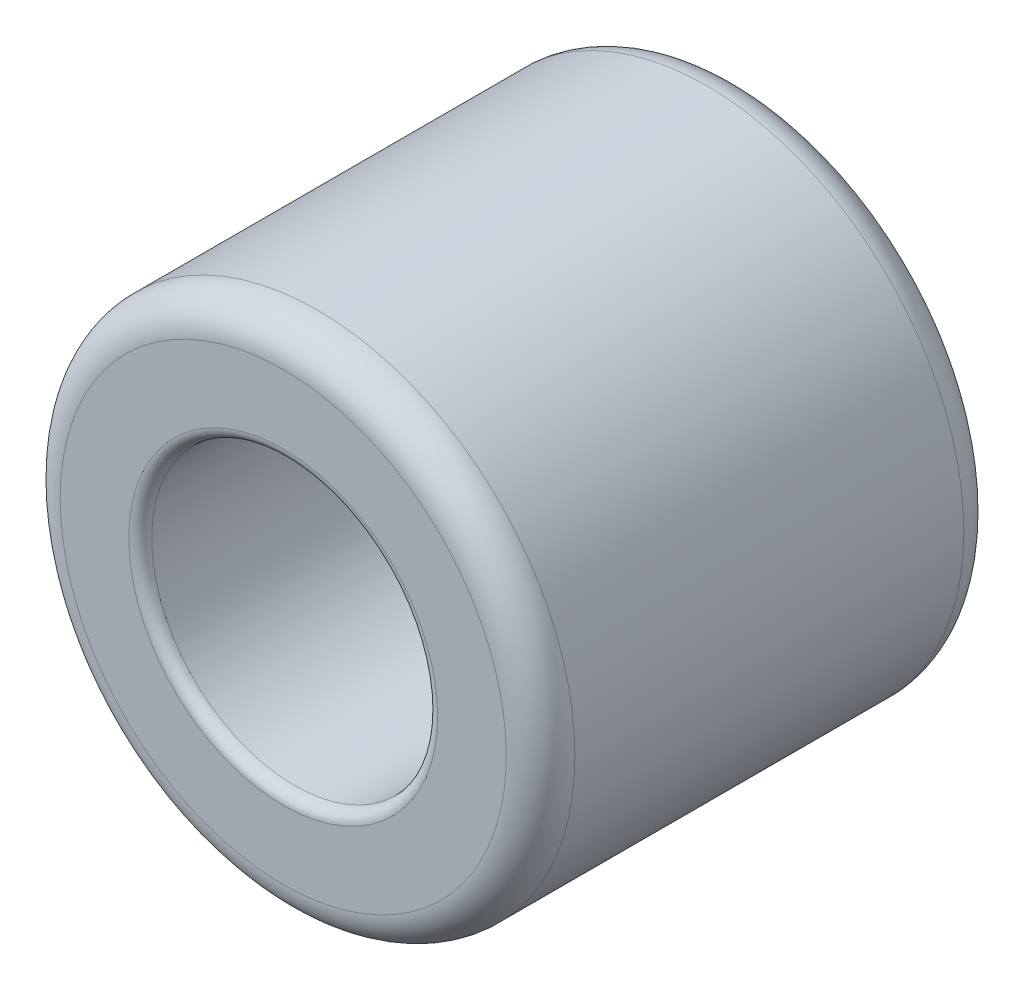
ISO-10303-21;
HEADER;
FILE_DESCRIPTION(('STEP AP214'),'2;1');
FILE_NAME('part.step','',(''),(''),'','','');
FILE_SCHEMA(('AUTOMOTIVE_DESIGN { 1 0 10303 214 1 1 1 1 }'));
ENDSEC;
DATA;
#1=APPLICATION_CONTEXT('core data for automotive mechanical design processes');
#2=APPLICATION_PROTOCOL_DEFINITION('international standard','automotive_design',2000,#1);
#3=PRODUCT_CONTEXT('',#1,'mechanical');
#4=PRODUCT('Part','Part','',(#3));
#5=PRODUCT_RELATED_PRODUCT_CATEGORY('part','',(#4));
#6=PRODUCT_DEFINITION_FORMATION('','',#4);
#7=PRODUCT_DEFINITION_CONTEXT('part definition',#1,'design');
#8=PRODUCT_DEFINITION('design','',#6,#7);
#9=PRODUCT_DEFINITION_SHAPE('','',#8);
#10=(LENGTH_UNIT() NAMED_UNIT(*) SI_UNIT(.MILLI.,.METRE.));
#11=(NAMED_UNIT(*) PLANE_ANGLE_UNIT() SI_UNIT($,.RADIAN.));
#12=(NAMED_UNIT(*) SI_UNIT($,.STERADIAN.) SOLID_ANGLE_UNIT());
#13=UNCERTAINTY_MEASURE_WITH_UNIT(LENGTH_MEASURE(1.E-05),#10,'distance_accuracy_value','');
#14=(GEOMETRIC_REPRESENTATION_CONTEXT(3) GLOBAL_UNCERTAINTY_ASSIGNED_CONTEXT((#13)) GLOBAL_UNIT_ASSIGNED_CONTEXT((#10,
#11,#12)) REPRESENTATION_CONTEXT('',''));
#15=CARTESIAN_POINT('',(0.,0.,0.));
#16=DIRECTION('',(0.,0.,1.));
#17=DIRECTION('',(1.,0.,0.));
#18=AXIS2_PLACEMENT_3D('',#15,#16,#17);
#19=CARTESIAN_POINT('',(0.,0.,20.));
#20=DIRECTION('',(0.,0.,-1.));
#21=DIRECTION('',(-1.,0.,0.));
#22=AXIS2_PLACEMENT_3D('',#19,#20,#21);
#23=CYLINDRICAL_SURFACE('',#22,12.5);
#24=CARTESIAN_POINT('',(0.,0.,-19.));
#25=DIRECTION('',(0.,0.,1.));
#26=DIRECTION('',(1.,0.,0.));
#27=AXIS2_PLACEMENT_3D('',#24,#25,#26);
#28=CIRCLE('',#27,12.5);
#29=CARTESIAN_POINT('',(12.5,0.,-19.));
#30=VERTEX_POINT('',#29);
#31=EDGE_CURVE('E46',#30,#30,#28,.F.);
#32=ORIENTED_EDGE('',*,*,#31,.T.);
#33=EDGE_LOOP('',(#32));
#34=FACE_BOUND('',#33,.T.);
#35=CARTESIAN_POINT('',(0.,0.,19.));
#36=DIRECTION('',(0.,0.,1.));
#37=DIRECTION('',(1.,0.,0.));
#38=AXIS2_PLACEMENT_3D('',#35,#36,#37);
#39=CIRCLE('',#38,12.5);
#40=CARTESIAN_POINT('',(12.5,0.,19.));
#41=VERTEX_POINT('',#40);
#42=EDGE_CURVE('E49',#41,#41,#39,.T.);
#43=ORIENTED_EDGE('',*,*,#42,.T.);
#44=EDGE_LOOP('',(#43));
#45=FACE_BOUND('',#44,.T.);
#46=ADVANCED_FACE('F39',(#34,#45),#23,.F.);
#47=CARTESIAN_POINT('',(0.,0.,20.));
#48=DIRECTION('',(0.,0.,-1.));
#49=DIRECTION('',(-1.,0.,0.));
#50=AXIS2_PLACEMENT_3D('',#47,#48,#49);
#51=CYLINDRICAL_SURFACE('',#50,22.5);
#52=CARTESIAN_POINT('',(0.,0.,-17.));
#53=DIRECTION('',(0.,0.,1.));
#54=DIRECTION('',(1.,0.,0.));
#55=AXIS2_PLACEMENT_3D('',#52,#53,#54);
#56=CIRCLE('',#55,22.5);
#57=CARTESIAN_POINT('',(22.5,0.,-17.));
#58=VERTEX_POINT('',#57);
#59=EDGE_CURVE('E61',#58,#58,#56,.T.);
#60=ORIENTED_EDGE('',*,*,#59,.T.);
#61=EDGE_LOOP('',(#60));
#62=FACE_BOUND('',#61,.T.);
#63=CARTESIAN_POINT('',(0.,0.,17.));
#64=DIRECTION('',(0.,0.,1.));
#65=DIRECTION('',(1.,0.,0.));
#66=AXIS2_PLACEMENT_3D('',#63,#64,#65);
#67=CIRCLE('',#66,22.5);
#68=CARTESIAN_POINT('',(22.5,0.,17.));
#69=VERTEX_POINT('',#68);
#70=EDGE_CURVE('E70',#69,#69,#67,.F.);
#71=ORIENTED_EDGE('',*,*,#70,.T.);
#72=EDGE_LOOP('',(#71));
#73=FACE_BOUND('',#72,.T.);
#74=ADVANCED_FACE('F75',(#62,#73),#51,.T.);
#75=CARTESIAN_POINT('',(0.,0.,20.));
#76=DIRECTION('',(0.,0.,1.));
#77=DIRECTION('',(1.,0.,0.));
#78=AXIS2_PLACEMENT_3D('',#75,#76,#77);
#79=PLANE('',#78);
#80=CARTESIAN_POINT('',(0.,0.,20.));
#81=DIRECTION('',(0.,0.,1.));
#82=DIRECTION('',(1.,0.,0.));
#83=AXIS2_PLACEMENT_3D('',#80,#81,#82);
#84=CIRCLE('',#83,13.5);
#85=CARTESIAN_POINT('',(13.5,0.,20.));
#86=VERTEX_POINT('',#85);
#87=EDGE_CURVE('E10',#86,#86,#84,.F.);
#88=ORIENTED_EDGE('',*,*,#87,.T.);
#89=EDGE_LOOP('',(#88));
#90=FACE_BOUND('',#89,.T.);
#91=CARTESIAN_POINT('',(0.,0.,20.));
#92=DIRECTION('',(0.,0.,1.));
#93=DIRECTION('',(1.,0.,0.));
#94=AXIS2_PLACEMENT_3D('',#91,#92,#93);
#95=CIRCLE('',#94,19.5);
#96=CARTESIAN_POINT('',(19.5,0.,20.));
#97=VERTEX_POINT('',#96);
#98=EDGE_CURVE('E56',#97,#97,#95,.T.);
#99=ORIENTED_EDGE('',*,*,#98,.T.);
#100=EDGE_LOOP('',(#99));
#101=FACE_BOUND('',#100,.T.);
#102=ADVANCED_FACE('F85',(#90,#101),#79,.T.);
#103=CARTESIAN_POINT('',(0.,0.,-20.));
#104=DIRECTION('',(0.,0.,1.));
#105=DIRECTION('',(1.,0.,0.));
#106=AXIS2_PLACEMENT_3D('',#103,#104,#105);
#107=PLANE('',#106);
#108=CARTESIAN_POINT('',(0.,0.,-20.));
#109=DIRECTION('',(0.,0.,1.));
#110=DIRECTION('',(1.,0.,0.));
#111=AXIS2_PLACEMENT_3D('',#108,#109,#110);
#112=CIRCLE('',#111,13.5);
#113=CARTESIAN_POINT('',(13.5,0.,-20.));
#114=VERTEX_POINT('',#113);
#115=EDGE_CURVE('E53',#114,#114,#112,.T.);
#116=ORIENTED_EDGE('',*,*,#115,.T.);
#117=EDGE_LOOP('',(#116));
#118=FACE_BOUND('',#117,.T.);
#119=CARTESIAN_POINT('',(0.,0.,-20.));
#120=DIRECTION('',(0.,0.,1.));
#121=DIRECTION('',(1.,0.,0.));
#122=AXIS2_PLACEMENT_3D('',#119,#120,#121);
#123=CIRCLE('',#122,19.5);
#124=CARTESIAN_POINT('',(19.5,0.,-20.));
#125=VERTEX_POINT('',#124);
#126=EDGE_CURVE('E64',#125,#125,#123,.F.);
#127=ORIENTED_EDGE('',*,*,#126,.T.);
#128=EDGE_LOOP('',(#127));
#129=FACE_BOUND('',#128,.T.);
#130=ADVANCED_FACE('F84',(#118,#129),#107,.F.);
#131=CARTESIAN_POINT('',(0.,0.,-17.));
#132=DIRECTION('',(0.,0.,1.));
#133=DIRECTION('',(1.,0.,0.));
#134=AXIS2_PLACEMENT_3D('',#131,#132,#133);
#135=TOROIDAL_SURFACE('',#134,19.5,3.);
#136=ORIENTED_EDGE('',*,*,#126,.F.);
#137=EDGE_LOOP('',(#136));
#138=FACE_BOUND('',#137,.T.);
#139=ORIENTED_EDGE('',*,*,#59,.F.);
#140=EDGE_LOOP('',(#139));
#141=FACE_BOUND('',#140,.T.);
#142=ADVANCED_FACE('F77',(#138,#141),#135,.T.);
#143=CARTESIAN_POINT('',(0.,0.,17.));
#144=DIRECTION('',(0.,0.,1.));
#145=DIRECTION('',(1.,0.,0.));
#146=AXIS2_PLACEMENT_3D('',#143,#144,#145);
#147=TOROIDAL_SURFACE('',#146,19.5,3.);
#148=ORIENTED_EDGE('',*,*,#70,.F.);
#149=EDGE_LOOP('',(#148));
#150=FACE_BOUND('',#149,.T.);
#151=ORIENTED_EDGE('',*,*,#98,.F.);
#152=EDGE_LOOP('',(#151));
#153=FACE_BOUND('',#152,.T.);
#154=ADVANCED_FACE('F74',(#150,#153),#147,.T.);
#155=CARTESIAN_POINT('',(0.,0.,-19.));
#156=DIRECTION('',(0.,0.,1.));
#157=DIRECTION('',(1.,0.,0.));
#158=AXIS2_PLACEMENT_3D('',#155,#156,#157);
#159=TOROIDAL_SURFACE('',#158,13.5,1.);
#160=ORIENTED_EDGE('',*,*,#31,.F.);
#161=EDGE_LOOP('',(#160));
#162=FACE_BOUND('',#161,.T.);
#163=ORIENTED_EDGE('',*,*,#115,.F.);
#164=EDGE_LOOP('',(#163));
#165=FACE_BOUND('',#164,.T.);
#166=ADVANCED_FACE('F79',(#162,#165),#159,.T.);
#167=CARTESIAN_POINT('',(0.,0.,19.));
#168=DIRECTION('',(0.,0.,1.));
#169=DIRECTION('',(1.,0.,0.));
#170=AXIS2_PLACEMENT_3D('',#167,#168,#169);
#171=TOROIDAL_SURFACE('',#170,13.5,1.);
#172=ORIENTED_EDGE('',*,*,#87,.F.);
#173=EDGE_LOOP('',(#172));
#174=FACE_BOUND('',#173,.T.);
#175=ORIENTED_EDGE('',*,*,#42,.F.);
#176=EDGE_LOOP('',(#175));
#177=FACE_BOUND('',#176,.T.);
#178=ADVANCED_FACE('F41',(#174,#177),#171,.T.);
#179=CLOSED_SHELL('',(#46,#74,#102,#130,#142,#154,#166,#178));
#180=MANIFOLD_SOLID_BREP('B2',#179);
#181=ADVANCED_BREP_SHAPE_REPRESENTATION('',(#18,#180),#14);
#182=SHAPE_DEFINITION_REPRESENTATION(#9,#181);
ENDSEC;
END-ISO-10303-21;
